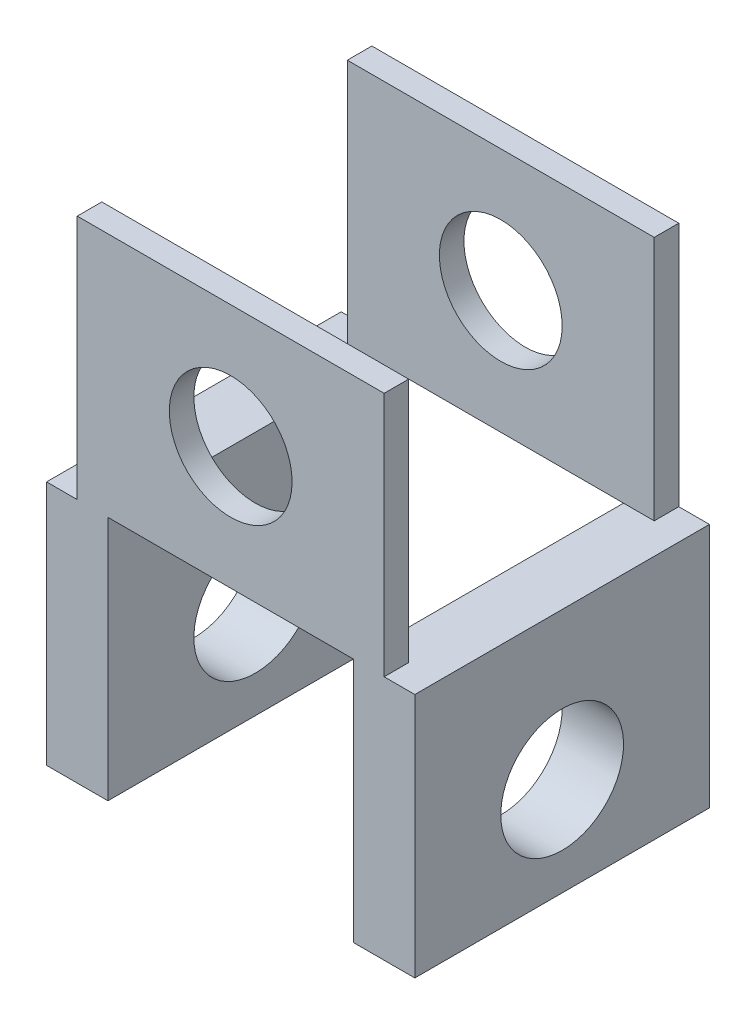
ISO-10303-21;
HEADER;
FILE_DESCRIPTION(('STEP AP214'),'2;1');
FILE_NAME('part.step','',(''),(''),'','','');
FILE_SCHEMA(('AUTOMOTIVE_DESIGN { 1 0 10303 214 1 1 1 1 }'));
ENDSEC;
DATA;
#1=APPLICATION_CONTEXT('core data for automotive mechanical design processes');
#2=APPLICATION_PROTOCOL_DEFINITION('international standard','automotive_design',2000,#1);
#3=PRODUCT_CONTEXT('',#1,'mechanical');
#4=PRODUCT('Part','Part','',(#3));
#5=PRODUCT_RELATED_PRODUCT_CATEGORY('part','',(#4));
#6=PRODUCT_DEFINITION_FORMATION('','',#4);
#7=PRODUCT_DEFINITION_CONTEXT('part definition',#1,'design');
#8=PRODUCT_DEFINITION('design','',#6,#7);
#9=PRODUCT_DEFINITION_SHAPE('','',#8);
#10=(LENGTH_UNIT() NAMED_UNIT(*) SI_UNIT(.MILLI.,.METRE.));
#11=(NAMED_UNIT(*) PLANE_ANGLE_UNIT() SI_UNIT($,.RADIAN.));
#12=(NAMED_UNIT(*) SI_UNIT($,.STERADIAN.) SOLID_ANGLE_UNIT());
#13=UNCERTAINTY_MEASURE_WITH_UNIT(LENGTH_MEASURE(1.E-05),#10,'distance_accuracy_value','');
#14=(GEOMETRIC_REPRESENTATION_CONTEXT(3) GLOBAL_UNCERTAINTY_ASSIGNED_CONTEXT((#13)) GLOBAL_UNIT_ASSIGNED_CONTEXT((#10,
#11,#12)) REPRESENTATION_CONTEXT('',''));
#15=CARTESIAN_POINT('',(0.,0.,0.));
#16=DIRECTION('',(0.,0.,1.));
#17=DIRECTION('',(1.,0.,0.));
#18=AXIS2_PLACEMENT_3D('',#15,#16,#17);
#19=CARTESIAN_POINT('',(0.,-10.,12.));
#20=DIRECTION('',(0.,1.,0.));
#21=DIRECTION('',(0.,0.,1.));
#22=AXIS2_PLACEMENT_3D('',#19,#20,#21);
#23=PLANE('',#22);
#24=DIRECTION('',(1.,0.,0.));
#25=VECTOR('',#24,1.);
#26=CARTESIAN_POINT('',(0.,-10.,24.));
#27=LINE('',#26,#25);
#28=CARTESIAN_POINT('',(-15.,-10.,24.));
#29=VERTEX_POINT('',#28);
#30=CARTESIAN_POINT('',(-12.5,-10.,24.));
#31=VERTEX_POINT('',#30);
#32=EDGE_CURVE('E218',#29,#31,#27,.T.);
#33=ORIENTED_EDGE('',*,*,#32,.T.);
#34=DIRECTION('',(0.,0.,1.));
#35=VECTOR('',#34,1.);
#36=CARTESIAN_POINT('',(-12.5,-10.,22.));
#37=LINE('',#36,#35);
#38=CARTESIAN_POINT('',(-12.5,-10.,22.));
#39=VERTEX_POINT('',#38);
#40=EDGE_CURVE('E197',#39,#31,#37,.T.);
#41=ORIENTED_EDGE('',*,*,#40,.F.);
#42=DIRECTION('',(1.,0.,0.));
#43=VECTOR('',#42,1.);
#44=CARTESIAN_POINT('',(0.,-10.,22.));
#45=LINE('',#44,#43);
#46=CARTESIAN_POINT('',(-10.,-10.,22.));
#47=VERTEX_POINT('',#46);
#48=EDGE_CURVE('E188',#39,#47,#45,.T.);
#49=ORIENTED_EDGE('',*,*,#48,.T.);
#50=DIRECTION('',(0.,0.,-1.));
#51=VECTOR('',#50,1.);
#52=CARTESIAN_POINT('',(-10.,-10.,12.));
#53=LINE('',#52,#51);
#54=CARTESIAN_POINT('',(-10.,-10.,2.));
#55=VERTEX_POINT('',#54);
#56=EDGE_CURVE('E267',#47,#55,#53,.T.);
#57=ORIENTED_EDGE('',*,*,#56,.T.);
#58=DIRECTION('',(1.,0.,0.));
#59=VECTOR('',#58,1.);
#60=CARTESIAN_POINT('',(0.,-10.,2.));
#61=LINE('',#60,#59);
#62=CARTESIAN_POINT('',(-12.5,-10.,2.));
#63=VERTEX_POINT('',#62);
#64=EDGE_CURVE('E300',#63,#55,#61,.T.);
#65=ORIENTED_EDGE('',*,*,#64,.F.);
#66=DIRECTION('',(0.,0.,-1.));
#67=VECTOR('',#66,1.);
#68=CARTESIAN_POINT('',(-12.5,-10.,2.));
#69=LINE('',#68,#67);
#70=CARTESIAN_POINT('',(-12.5,-10.,0.));
#71=VERTEX_POINT('',#70);
#72=EDGE_CURVE('E316',#63,#71,#69,.T.);
#73=ORIENTED_EDGE('',*,*,#72,.T.);
#74=DIRECTION('',(1.,0.,0.));
#75=VECTOR('',#74,1.);
#76=CARTESIAN_POINT('',(0.,-10.,0.));
#77=LINE('',#76,#75);
#78=CARTESIAN_POINT('',(-15.,-10.,0.));
#79=VERTEX_POINT('',#78);
#80=EDGE_CURVE('E240',#79,#71,#77,.T.);
#81=ORIENTED_EDGE('',*,*,#80,.F.);
#82=DIRECTION('',(0.,0.,-1.));
#83=VECTOR('',#82,1.);
#84=CARTESIAN_POINT('',(-15.,-10.,12.));
#85=LINE('',#84,#83);
#86=EDGE_CURVE('E258',#29,#79,#85,.T.);
#87=ORIENTED_EDGE('',*,*,#86,.F.);
#88=EDGE_LOOP('',(#33,#41,#49,#57,#65,#73,#81,#87));
#89=FACE_BOUND('',#88,.T.);
#90=ADVANCED_FACE('F41',(#89),#23,.T.);
#91=CARTESIAN_POINT('',(0.,-10.,2.));
#92=DIRECTION('',(0.,1.,0.));
#93=DIRECTION('',(0.,0.,1.));
#94=AXIS2_PLACEMENT_3D('',#91,#92,#93);
#95=PLANE('',#94);
#96=CARTESIAN_POINT('',(10.,-10.,2.));
#97=VERTEX_POINT('',#96);
#98=EDGE_CURVE('E305',#55,#97,#61,.T.);
#99=ORIENTED_EDGE('',*,*,#98,.F.);
#100=CARTESIAN_POINT('',(-10.,-10.,0.));
#101=VERTEX_POINT('',#100);
#102=EDGE_CURVE('E261',#55,#101,#53,.T.);
#103=ORIENTED_EDGE('',*,*,#102,.T.);
#104=DIRECTION('',(1.,0.,0.));
#105=VECTOR('',#104,1.);
#106=CARTESIAN_POINT('',(0.,-10.,0.));
#107=LINE('',#106,#105);
#108=CARTESIAN_POINT('',(10.,-10.,0.));
#109=VERTEX_POINT('',#108);
#110=EDGE_CURVE('E320',#101,#109,#107,.T.);
#111=ORIENTED_EDGE('',*,*,#110,.T.);
#112=DIRECTION('',(0.,0.,-1.));
#113=VECTOR('',#112,1.);
#114=CARTESIAN_POINT('',(10.,-10.,12.));
#115=LINE('',#114,#113);
#116=EDGE_CURVE('E11',#97,#109,#115,.T.);
#117=ORIENTED_EDGE('',*,*,#116,.F.);
#118=EDGE_LOOP('',(#99,#103,#111,#117));
#119=FACE_BOUND('',#118,.T.);
#120=ADVANCED_FACE('F437',(#119),#95,.F.);
#121=CARTESIAN_POINT('',(12.5,0.,2.));
#122=DIRECTION('',(-1.,0.,0.));
#123=DIRECTION('',(0.,0.,1.));
#124=AXIS2_PLACEMENT_3D('',#121,#122,#123);
#125=PLANE('',#124);
#126=DIRECTION('',(0.,1.,0.));
#127=VECTOR('',#126,1.);
#128=CARTESIAN_POINT('',(12.5,0.,0.));
#129=LINE('',#128,#127);
#130=CARTESIAN_POINT('',(12.5,-10.,0.));
#131=VERTEX_POINT('',#130);
#132=CARTESIAN_POINT('',(12.5,10.,0.));
#133=VERTEX_POINT('',#132);
#134=EDGE_CURVE('E323',#131,#133,#129,.T.);
#135=ORIENTED_EDGE('',*,*,#134,.T.);
#136=DIRECTION('',(0.,0.,-1.));
#137=VECTOR('',#136,1.);
#138=CARTESIAN_POINT('',(12.5,10.,2.));
#139=LINE('',#138,#137);
#140=CARTESIAN_POINT('',(12.5,10.,2.));
#141=VERTEX_POINT('',#140);
#142=EDGE_CURVE('E339',#141,#133,#139,.T.);
#143=ORIENTED_EDGE('',*,*,#142,.F.);
#144=DIRECTION('',(0.,1.,0.));
#145=VECTOR('',#144,1.);
#146=CARTESIAN_POINT('',(12.5,0.,2.));
#147=LINE('',#146,#145);
#148=CARTESIAN_POINT('',(12.5,-10.,2.));
#149=VERTEX_POINT('',#148);
#150=EDGE_CURVE('E304',#149,#141,#147,.T.);
#151=ORIENTED_EDGE('',*,*,#150,.F.);
#152=DIRECTION('',(0.,0.,-1.));
#153=VECTOR('',#152,1.);
#154=CARTESIAN_POINT('',(12.5,-10.,2.));
#155=LINE('',#154,#153);
#156=EDGE_CURVE('E45',#149,#131,#155,.T.);
#157=ORIENTED_EDGE('',*,*,#156,.T.);
#158=EDGE_LOOP('',(#135,#143,#151,#157));
#159=FACE_BOUND('',#158,.T.);
#160=ADVANCED_FACE('F350',(#159),#125,.F.);
#161=CARTESIAN_POINT('',(0.,10.,2.));
#162=DIRECTION('',(0.,1.,0.));
#163=DIRECTION('',(0.,0.,1.));
#164=AXIS2_PLACEMENT_3D('',#161,#162,#163);
#165=PLANE('',#164);
#166=DIRECTION('',(1.,0.,0.));
#167=VECTOR('',#166,1.);
#168=CARTESIAN_POINT('',(0.,10.,0.));
#169=LINE('',#168,#167);
#170=CARTESIAN_POINT('',(-12.5,10.,0.));
#171=VERTEX_POINT('',#170);
#172=EDGE_CURVE('E327',#171,#133,#169,.T.);
#173=ORIENTED_EDGE('',*,*,#172,.F.);
#174=DIRECTION('',(0.,0.,-1.));
#175=VECTOR('',#174,1.);
#176=CARTESIAN_POINT('',(-12.5,10.,2.));
#177=LINE('',#176,#175);
#178=CARTESIAN_POINT('',(-12.5,10.,2.));
#179=VERTEX_POINT('',#178);
#180=EDGE_CURVE('E337',#179,#171,#177,.T.);
#181=ORIENTED_EDGE('',*,*,#180,.F.);
#182=DIRECTION('',(1.,0.,0.));
#183=VECTOR('',#182,1.);
#184=CARTESIAN_POINT('',(0.,10.,2.));
#185=LINE('',#184,#183);
#186=EDGE_CURVE('E308',#179,#141,#185,.T.);
#187=ORIENTED_EDGE('',*,*,#186,.T.);
#188=ORIENTED_EDGE('',*,*,#142,.T.);
#189=EDGE_LOOP('',(#173,#181,#187,#188));
#190=FACE_BOUND('',#189,.T.);
#191=ADVANCED_FACE('F357',(#190),#165,.T.);
#192=CARTESIAN_POINT('',(0.,0.,2.));
#193=DIRECTION('',(0.,0.,-1.));
#194=DIRECTION('',(-1.,0.,0.));
#195=AXIS2_PLACEMENT_3D('',#192,#193,#194);
#196=CYLINDRICAL_SURFACE('',#195,5.);
#197=CARTESIAN_POINT('',(0.,0.,2.));
#198=DIRECTION('',(0.,0.,1.));
#199=DIRECTION('',(1.,0.,0.));
#200=AXIS2_PLACEMENT_3D('',#197,#198,#199);
#201=CIRCLE('',#200,5.);
#202=CARTESIAN_POINT('',(5.,0.,2.));
#203=VERTEX_POINT('',#202);
#204=EDGE_CURVE('E294',#203,#203,#201,.T.);
#205=ORIENTED_EDGE('',*,*,#204,.T.);
#206=EDGE_LOOP('',(#205));
#207=FACE_BOUND('',#206,.T.);
#208=CARTESIAN_POINT('',(0.,0.,0.));
#209=DIRECTION('',(0.,0.,1.));
#210=DIRECTION('',(1.,0.,0.));
#211=AXIS2_PLACEMENT_3D('',#208,#209,#210);
#212=CIRCLE('',#211,5.);
#213=CARTESIAN_POINT('',(5.,0.,0.));
#214=VERTEX_POINT('',#213);
#215=EDGE_CURVE('E293',#214,#214,#212,.T.);
#216=ORIENTED_EDGE('',*,*,#215,.F.);
#217=EDGE_LOOP('',(#216));
#218=FACE_BOUND('',#217,.T.);
#219=ADVANCED_FACE('F43',(#207,#218),#196,.F.);
#220=CARTESIAN_POINT('',(-12.5,0.,2.));
#221=DIRECTION('',(-1.,0.,0.));
#222=DIRECTION('',(0.,0.,1.));
#223=AXIS2_PLACEMENT_3D('',#220,#221,#222);
#224=PLANE('',#223);
#225=DIRECTION('',(0.,1.,0.));
#226=VECTOR('',#225,1.);
#227=CARTESIAN_POINT('',(-12.5,0.,0.));
#228=LINE('',#227,#226);
#229=EDGE_CURVE('E299',#71,#171,#228,.T.);
#230=ORIENTED_EDGE('',*,*,#229,.F.);
#231=ORIENTED_EDGE('',*,*,#72,.F.);
#232=DIRECTION('',(0.,1.,0.));
#233=VECTOR('',#232,1.);
#234=CARTESIAN_POINT('',(-12.5,0.,2.));
#235=LINE('',#234,#233);
#236=EDGE_CURVE('E312',#63,#179,#235,.T.);
#237=ORIENTED_EDGE('',*,*,#236,.T.);
#238=ORIENTED_EDGE('',*,*,#180,.T.);
#239=EDGE_LOOP('',(#230,#231,#237,#238));
#240=FACE_BOUND('',#239,.T.);
#241=ADVANCED_FACE('F364',(#240),#224,.T.);
#242=CARTESIAN_POINT('',(0.,0.,2.));
#243=DIRECTION('',(0.,0.,1.));
#244=DIRECTION('',(1.,0.,0.));
#245=AXIS2_PLACEMENT_3D('',#242,#243,#244);
#246=PLANE('',#245);
#247=ORIENTED_EDGE('',*,*,#204,.F.);
#248=EDGE_LOOP('',(#247));
#249=FACE_BOUND('',#248,.T.);
#250=ORIENTED_EDGE('',*,*,#64,.T.);
#251=ORIENTED_EDGE('',*,*,#98,.T.);
#252=EDGE_CURVE('E298',#97,#149,#61,.T.);
#253=ORIENTED_EDGE('',*,*,#252,.T.);
#254=ORIENTED_EDGE('',*,*,#150,.T.);
#255=ORIENTED_EDGE('',*,*,#186,.F.);
#256=ORIENTED_EDGE('',*,*,#236,.F.);
#257=EDGE_LOOP('',(#250,#251,#253,#254,#255,#256));
#258=FACE_BOUND('',#257,.T.);
#259=ADVANCED_FACE('F362',(#249,#258),#246,.T.);
#260=CARTESIAN_POINT('',(0.,0.,0.));
#261=DIRECTION('',(0.,0.,1.));
#262=DIRECTION('',(1.,0.,0.));
#263=AXIS2_PLACEMENT_3D('',#260,#261,#262);
#264=PLANE('',#263);
#265=ORIENTED_EDGE('',*,*,#215,.T.);
#266=EDGE_LOOP('',(#265));
#267=FACE_BOUND('',#266,.T.);
#268=ORIENTED_EDGE('',*,*,#110,.F.);
#269=DIRECTION('',(0.,-1.,0.));
#270=VECTOR('',#269,1.);
#271=CARTESIAN_POINT('',(-10.,0.,0.));
#272=LINE('',#271,#270);
#273=CARTESIAN_POINT('',(-10.,-30.,0.));
#274=VERTEX_POINT('',#273);
#275=EDGE_CURVE('E236',#101,#274,#272,.T.);
#276=ORIENTED_EDGE('',*,*,#275,.T.);
#277=DIRECTION('',(1.,0.,0.));
#278=VECTOR('',#277,1.);
#279=CARTESIAN_POINT('',(0.,-30.,0.));
#280=LINE('',#279,#278);
#281=CARTESIAN_POINT('',(-15.,-30.,0.));
#282=VERTEX_POINT('',#281);
#283=EDGE_CURVE('E247',#282,#274,#280,.T.);
#284=ORIENTED_EDGE('',*,*,#283,.F.);
#285=DIRECTION('',(0.,-1.,0.));
#286=VECTOR('',#285,1.);
#287=CARTESIAN_POINT('',(-15.,0.,0.));
#288=LINE('',#287,#286);
#289=EDGE_CURVE('E244',#79,#282,#288,.T.);
#290=ORIENTED_EDGE('',*,*,#289,.F.);
#291=ORIENTED_EDGE('',*,*,#80,.T.);
#292=ORIENTED_EDGE('',*,*,#229,.T.);
#293=ORIENTED_EDGE('',*,*,#172,.T.);
#294=ORIENTED_EDGE('',*,*,#134,.F.);
#295=DIRECTION('',(1.,0.,0.));
#296=VECTOR('',#295,1.);
#297=CARTESIAN_POINT('',(0.,-10.,0.));
#298=LINE('',#297,#296);
#299=CARTESIAN_POINT('',(15.,-10.,0.));
#300=VERTEX_POINT('',#299);
#301=EDGE_CURVE('E266',#131,#300,#298,.T.);
#302=ORIENTED_EDGE('',*,*,#301,.T.);
#303=DIRECTION('',(0.,-1.,0.));
#304=VECTOR('',#303,1.);
#305=CARTESIAN_POINT('',(15.,0.,0.));
#306=LINE('',#305,#304);
#307=CARTESIAN_POINT('',(15.,-30.,0.));
#308=VERTEX_POINT('',#307);
#309=EDGE_CURVE('E277',#300,#308,#306,.T.);
#310=ORIENTED_EDGE('',*,*,#309,.T.);
#311=DIRECTION('',(1.,0.,0.));
#312=VECTOR('',#311,1.);
#313=CARTESIAN_POINT('',(0.,-30.,0.));
#314=LINE('',#313,#312);
#315=CARTESIAN_POINT('',(10.,-30.,0.));
#316=VERTEX_POINT('',#315);
#317=EDGE_CURVE('E273',#316,#308,#314,.T.);
#318=ORIENTED_EDGE('',*,*,#317,.F.);
#319=DIRECTION('',(0.,-1.,0.));
#320=VECTOR('',#319,1.);
#321=CARTESIAN_POINT('',(10.,0.,0.));
#322=LINE('',#321,#320);
#323=EDGE_CURVE('E270',#109,#316,#322,.T.);
#324=ORIENTED_EDGE('',*,*,#323,.F.);
#325=EDGE_LOOP('',(#268,#276,#284,#290,#291,#292,#293,#294,#302,#310,#318,#324));
#326=FACE_BOUND('',#325,.T.);
#327=ADVANCED_FACE('F355',(#267,#326),#264,.F.);
#328=CARTESIAN_POINT('',(0.,-10.,12.));
#329=DIRECTION('',(0.,1.,0.));
#330=DIRECTION('',(0.,0.,1.));
#331=AXIS2_PLACEMENT_3D('',#328,#329,#330);
#332=PLANE('',#331);
#333=DIRECTION('',(0.,0.,1.));
#334=VECTOR('',#333,1.);
#335=CARTESIAN_POINT('',(12.5,-10.,22.));
#336=LINE('',#335,#334);
#337=CARTESIAN_POINT('',(12.5,-10.,22.));
#338=VERTEX_POINT('',#337);
#339=CARTESIAN_POINT('',(12.5,-10.,24.));
#340=VERTEX_POINT('',#339);
#341=EDGE_CURVE('E203',#338,#340,#336,.T.);
#342=ORIENTED_EDGE('',*,*,#341,.T.);
#343=DIRECTION('',(1.,0.,0.));
#344=VECTOR('',#343,1.);
#345=CARTESIAN_POINT('',(0.,-10.,24.));
#346=LINE('',#345,#344);
#347=CARTESIAN_POINT('',(15.,-10.,24.));
#348=VERTEX_POINT('',#347);
#349=EDGE_CURVE('E221',#340,#348,#346,.T.);
#350=ORIENTED_EDGE('',*,*,#349,.T.);
#351=DIRECTION('',(0.,0.,-1.));
#352=VECTOR('',#351,1.);
#353=CARTESIAN_POINT('',(15.,-10.,12.));
#354=LINE('',#353,#352);
#355=EDGE_CURVE('E281',#348,#300,#354,.T.);
#356=ORIENTED_EDGE('',*,*,#355,.T.);
#357=ORIENTED_EDGE('',*,*,#301,.F.);
#358=ORIENTED_EDGE('',*,*,#156,.F.);
#359=ORIENTED_EDGE('',*,*,#252,.F.);
#360=CARTESIAN_POINT('',(10.,-10.,22.));
#361=VERTEX_POINT('',#360);
#362=EDGE_CURVE('E53',#361,#97,#115,.T.);
#363=ORIENTED_EDGE('',*,*,#362,.F.);
#364=EDGE_CURVE('E60',#361,#338,#45,.T.);
#365=ORIENTED_EDGE('',*,*,#364,.T.);
#366=EDGE_LOOP('',(#342,#350,#356,#357,#358,#359,#363,#365));
#367=FACE_BOUND('',#366,.T.);
#368=ADVANCED_FACE('F351',(#367),#332,.T.);
#369=CARTESIAN_POINT('',(10.,0.,12.));
#370=DIRECTION('',(1.,0.,0.));
#371=DIRECTION('',(0.,1.,0.));
#372=AXIS2_PLACEMENT_3D('',#369,#370,#371);
#373=PLANE('',#372);
#374=CARTESIAN_POINT('',(10.,-22.,12.));
#375=DIRECTION('',(1.,0.,0.));
#376=DIRECTION('',(0.,1.,0.));
#377=AXIS2_PLACEMENT_3D('',#374,#375,#376);
#378=CIRCLE('',#377,5.);
#379=CARTESIAN_POINT('',(10.,-27.,12.));
#380=VERTEX_POINT('',#379);
#381=EDGE_CURVE('E410',#380,#380,#378,.T.);
#382=ORIENTED_EDGE('',*,*,#381,.T.);
#383=EDGE_LOOP('',(#382));
#384=FACE_BOUND('',#383,.T.);
#385=ORIENTED_EDGE('',*,*,#323,.T.);
#386=DIRECTION('',(0.,0.,-1.));
#387=VECTOR('',#386,1.);
#388=CARTESIAN_POINT('',(10.,-30.,12.));
#389=LINE('',#388,#387);
#390=CARTESIAN_POINT('',(10.,-30.,24.));
#391=VERTEX_POINT('',#390);
#392=EDGE_CURVE('E288',#391,#316,#389,.T.);
#393=ORIENTED_EDGE('',*,*,#392,.F.);
#394=DIRECTION('',(0.,-1.,0.));
#395=VECTOR('',#394,1.);
#396=CARTESIAN_POINT('',(10.,0.,24.));
#397=LINE('',#396,#395);
#398=CARTESIAN_POINT('',(10.,-10.,24.));
#399=VERTEX_POINT('',#398);
#400=EDGE_CURVE('E232',#399,#391,#397,.T.);
#401=ORIENTED_EDGE('',*,*,#400,.F.);
#402=EDGE_CURVE('E52',#399,#361,#115,.T.);
#403=ORIENTED_EDGE('',*,*,#402,.T.);
#404=ORIENTED_EDGE('',*,*,#362,.T.);
#405=ORIENTED_EDGE('',*,*,#116,.T.);
#406=EDGE_LOOP('',(#385,#393,#401,#403,#404,#405));
#407=FACE_BOUND('',#406,.T.);
#408=ADVANCED_FACE('F433',(#384,#407),#373,.F.);
#409=CARTESIAN_POINT('',(0.,-30.,12.));
#410=DIRECTION('',(0.,1.,0.));
#411=DIRECTION('',(0.,0.,1.));
#412=AXIS2_PLACEMENT_3D('',#409,#410,#411);
#413=PLANE('',#412);
#414=ORIENTED_EDGE('',*,*,#317,.T.);
#415=DIRECTION('',(0.,0.,-1.));
#416=VECTOR('',#415,1.);
#417=CARTESIAN_POINT('',(15.,-30.,12.));
#418=LINE('',#417,#416);
#419=CARTESIAN_POINT('',(15.,-30.,24.));
#420=VERTEX_POINT('',#419);
#421=EDGE_CURVE('E285',#420,#308,#418,.T.);
#422=ORIENTED_EDGE('',*,*,#421,.F.);
#423=DIRECTION('',(1.,0.,0.));
#424=VECTOR('',#423,1.);
#425=CARTESIAN_POINT('',(0.,-30.,24.));
#426=LINE('',#425,#424);
#427=EDGE_CURVE('E228',#391,#420,#426,.T.);
#428=ORIENTED_EDGE('',*,*,#427,.F.);
#429=ORIENTED_EDGE('',*,*,#392,.T.);
#430=EDGE_LOOP('',(#414,#422,#428,#429));
#431=FACE_BOUND('',#430,.T.);
#432=ADVANCED_FACE('F430',(#431),#413,.F.);
#433=CARTESIAN_POINT('',(15.,0.,12.));
#434=DIRECTION('',(1.,0.,0.));
#435=DIRECTION('',(0.,1.,0.));
#436=AXIS2_PLACEMENT_3D('',#433,#434,#435);
#437=PLANE('',#436);
#438=CARTESIAN_POINT('',(15.,-22.,12.));
#439=DIRECTION('',(1.,0.,0.));
#440=DIRECTION('',(0.,1.,0.));
#441=AXIS2_PLACEMENT_3D('',#438,#439,#440);
#442=CIRCLE('',#441,5.);
#443=CARTESIAN_POINT('',(15.,-27.,12.));
#444=VERTEX_POINT('',#443);
#445=EDGE_CURVE('E513',#444,#444,#442,.T.);
#446=ORIENTED_EDGE('',*,*,#445,.F.);
#447=EDGE_LOOP('',(#446));
#448=FACE_BOUND('',#447,.T.);
#449=ORIENTED_EDGE('',*,*,#309,.F.);
#450=ORIENTED_EDGE('',*,*,#355,.F.);
#451=DIRECTION('',(0.,-1.,0.));
#452=VECTOR('',#451,1.);
#453=CARTESIAN_POINT('',(15.,0.,24.));
#454=LINE('',#453,#452);
#455=EDGE_CURVE('E224',#348,#420,#454,.T.);
#456=ORIENTED_EDGE('',*,*,#455,.T.);
#457=ORIENTED_EDGE('',*,*,#421,.T.);
#458=EDGE_LOOP('',(#449,#450,#456,#457));
#459=FACE_BOUND('',#458,.T.);
#460=ADVANCED_FACE('F428',(#448,#459),#437,.T.);
#461=CARTESIAN_POINT('',(-10.,0.,12.));
#462=DIRECTION('',(1.,0.,0.));
#463=DIRECTION('',(0.,1.,0.));
#464=AXIS2_PLACEMENT_3D('',#461,#462,#463);
#465=PLANE('',#464);
#466=CARTESIAN_POINT('',(-10.,-22.,12.));
#467=DIRECTION('',(1.,0.,0.));
#468=DIRECTION('',(0.,1.,0.));
#469=AXIS2_PLACEMENT_3D('',#466,#467,#468);
#470=CIRCLE('',#469,5.);
#471=CARTESIAN_POINT('',(-10.,-27.,12.));
#472=VERTEX_POINT('',#471);
#473=EDGE_CURVE('E506',#472,#472,#470,.T.);
#474=ORIENTED_EDGE('',*,*,#473,.F.);
#475=EDGE_LOOP('',(#474));
#476=FACE_BOUND('',#475,.T.);
#477=ORIENTED_EDGE('',*,*,#275,.F.);
#478=ORIENTED_EDGE('',*,*,#102,.F.);
#479=ORIENTED_EDGE('',*,*,#56,.F.);
#480=CARTESIAN_POINT('',(-10.,-10.,24.));
#481=VERTEX_POINT('',#480);
#482=EDGE_CURVE('E262',#481,#47,#53,.T.);
#483=ORIENTED_EDGE('',*,*,#482,.F.);
#484=DIRECTION('',(0.,-1.,0.));
#485=VECTOR('',#484,1.);
#486=CARTESIAN_POINT('',(-10.,0.,24.));
#487=LINE('',#486,#485);
#488=CARTESIAN_POINT('',(-10.,-30.,24.));
#489=VERTEX_POINT('',#488);
#490=EDGE_CURVE('E201',#481,#489,#487,.T.);
#491=ORIENTED_EDGE('',*,*,#490,.T.);
#492=DIRECTION('',(0.,0.,-1.));
#493=VECTOR('',#492,1.);
#494=CARTESIAN_POINT('',(-10.,-30.,12.));
#495=LINE('',#494,#493);
#496=EDGE_CURVE('E251',#489,#274,#495,.T.);
#497=ORIENTED_EDGE('',*,*,#496,.T.);
#498=EDGE_LOOP('',(#477,#478,#479,#483,#491,#497));
#499=FACE_BOUND('',#498,.T.);
#500=ADVANCED_FACE('F388',(#476,#499),#465,.T.);
#501=CARTESIAN_POINT('',(-15.,0.,12.));
#502=DIRECTION('',(1.,0.,0.));
#503=DIRECTION('',(0.,1.,0.));
#504=AXIS2_PLACEMENT_3D('',#501,#502,#503);
#505=PLANE('',#504);
#506=CARTESIAN_POINT('',(-15.,-22.,12.));
#507=DIRECTION('',(-1.,0.,0.));
#508=DIRECTION('',(0.,-1.,0.));
#509=AXIS2_PLACEMENT_3D('',#506,#507,#508);
#510=CIRCLE('',#509,5.);
#511=CARTESIAN_POINT('',(-15.,-27.,12.));
#512=VERTEX_POINT('',#511);
#513=EDGE_CURVE('E509',#512,#512,#510,.T.);
#514=ORIENTED_EDGE('',*,*,#513,.F.);
#515=EDGE_LOOP('',(#514));
#516=FACE_BOUND('',#515,.T.);
#517=ORIENTED_EDGE('',*,*,#289,.T.);
#518=DIRECTION('',(0.,0.,-1.));
#519=VECTOR('',#518,1.);
#520=CARTESIAN_POINT('',(-15.,-30.,12.));
#521=LINE('',#520,#519);
#522=CARTESIAN_POINT('',(-15.,-30.,24.));
#523=VERTEX_POINT('',#522);
#524=EDGE_CURVE('E254',#523,#282,#521,.T.);
#525=ORIENTED_EDGE('',*,*,#524,.F.);
#526=DIRECTION('',(0.,-1.,0.));
#527=VECTOR('',#526,1.);
#528=CARTESIAN_POINT('',(-15.,0.,24.));
#529=LINE('',#528,#527);
#530=EDGE_CURVE('E214',#29,#523,#529,.T.);
#531=ORIENTED_EDGE('',*,*,#530,.F.);
#532=ORIENTED_EDGE('',*,*,#86,.T.);
#533=EDGE_LOOP('',(#517,#525,#531,#532));
#534=FACE_BOUND('',#533,.T.);
#535=ADVANCED_FACE('F370',(#516,#534),#505,.F.);
#536=CARTESIAN_POINT('',(0.,-30.,12.));
#537=DIRECTION('',(0.,1.,0.));
#538=DIRECTION('',(0.,0.,1.));
#539=AXIS2_PLACEMENT_3D('',#536,#537,#538);
#540=PLANE('',#539);
#541=ORIENTED_EDGE('',*,*,#283,.T.);
#542=ORIENTED_EDGE('',*,*,#496,.F.);
#543=DIRECTION('',(1.,0.,0.));
#544=VECTOR('',#543,1.);
#545=CARTESIAN_POINT('',(0.,-30.,24.));
#546=LINE('',#545,#544);
#547=EDGE_CURVE('E210',#523,#489,#546,.T.);
#548=ORIENTED_EDGE('',*,*,#547,.F.);
#549=ORIENTED_EDGE('',*,*,#524,.T.);
#550=EDGE_LOOP('',(#541,#542,#548,#549));
#551=FACE_BOUND('',#550,.T.);
#552=ADVANCED_FACE('F374',(#551),#540,.F.);
#553=CARTESIAN_POINT('',(0.,0.,24.));
#554=DIRECTION('',(0.,0.,-1.));
#555=DIRECTION('',(1.,0.,0.));
#556=AXIS2_PLACEMENT_3D('',#553,#554,#555);
#557=PLANE('',#556);
#558=ORIENTED_EDGE('',*,*,#349,.F.);
#559=DIRECTION('',(0.,1.,0.));
#560=VECTOR('',#559,1.);
#561=CARTESIAN_POINT('',(12.5,0.,24.));
#562=LINE('',#561,#560);
#563=CARTESIAN_POINT('',(12.5,10.,24.));
#564=VERTEX_POINT('',#563);
#565=EDGE_CURVE('E418',#340,#564,#562,.T.);
#566=ORIENTED_EDGE('',*,*,#565,.T.);
#567=DIRECTION('',(1.,0.,0.));
#568=VECTOR('',#567,1.);
#569=CARTESIAN_POINT('',(0.,10.,24.));
#570=LINE('',#569,#568);
#571=CARTESIAN_POINT('',(-12.5,10.,24.));
#572=VERTEX_POINT('',#571);
#573=EDGE_CURVE('E415',#572,#564,#570,.T.);
#574=ORIENTED_EDGE('',*,*,#573,.F.);
#575=DIRECTION('',(0.,1.,0.));
#576=VECTOR('',#575,1.);
#577=CARTESIAN_POINT('',(-12.5,0.,24.));
#578=LINE('',#577,#576);
#579=EDGE_CURVE('E195',#31,#572,#578,.T.);
#580=ORIENTED_EDGE('',*,*,#579,.F.);
#581=ORIENTED_EDGE('',*,*,#32,.F.);
#582=ORIENTED_EDGE('',*,*,#530,.T.);
#583=ORIENTED_EDGE('',*,*,#547,.T.);
#584=ORIENTED_EDGE('',*,*,#490,.F.);
#585=DIRECTION('',(1.,0.,0.));
#586=VECTOR('',#585,1.);
#587=CARTESIAN_POINT('',(0.,-10.,24.));
#588=LINE('',#587,#586);
#589=EDGE_CURVE('E397',#481,#399,#588,.T.);
#590=ORIENTED_EDGE('',*,*,#589,.T.);
#591=ORIENTED_EDGE('',*,*,#400,.T.);
#592=ORIENTED_EDGE('',*,*,#427,.T.);
#593=ORIENTED_EDGE('',*,*,#455,.F.);
#594=EDGE_LOOP('',(#558,#566,#574,#580,#581,#582,#583,#584,#590,#591,#592,#593));
#595=FACE_BOUND('',#594,.T.);
#596=CARTESIAN_POINT('',(0.,0.,24.));
#597=DIRECTION('',(0.,0.,1.));
#598=DIRECTION('',(1.,0.,0.));
#599=AXIS2_PLACEMENT_3D('',#596,#597,#598);
#600=CIRCLE('',#599,5.);
#601=CARTESIAN_POINT('',(5.,0.,24.));
#602=VERTEX_POINT('',#601);
#603=EDGE_CURVE('E406',#602,#602,#600,.T.);
#604=ORIENTED_EDGE('',*,*,#603,.F.);
#605=EDGE_LOOP('',(#604));
#606=FACE_BOUND('',#605,.T.);
#607=ADVANCED_FACE('F377',(#595,#606),#557,.F.);
#608=CARTESIAN_POINT('',(0.,-10.,22.));
#609=DIRECTION('',(0.,-1.,0.));
#610=DIRECTION('',(0.,0.,-1.));
#611=AXIS2_PLACEMENT_3D('',#608,#609,#610);
#612=PLANE('',#611);
#613=ORIENTED_EDGE('',*,*,#402,.F.);
#614=ORIENTED_EDGE('',*,*,#589,.F.);
#615=ORIENTED_EDGE('',*,*,#482,.T.);
#616=EDGE_CURVE('E382',#47,#361,#45,.T.);
#617=ORIENTED_EDGE('',*,*,#616,.T.);
#618=EDGE_LOOP('',(#613,#614,#615,#617));
#619=FACE_BOUND('',#618,.T.);
#620=ADVANCED_FACE('F395',(#619),#612,.T.);
#621=CARTESIAN_POINT('',(-12.5,0.,22.));
#622=DIRECTION('',(1.,0.,0.));
#623=DIRECTION('',(0.,0.,-1.));
#624=AXIS2_PLACEMENT_3D('',#621,#622,#623);
#625=PLANE('',#624);
#626=ORIENTED_EDGE('',*,*,#579,.T.);
#627=DIRECTION('',(0.,0.,1.));
#628=VECTOR('',#627,1.);
#629=CARTESIAN_POINT('',(-12.5,10.,22.));
#630=LINE('',#629,#628);
#631=CARTESIAN_POINT('',(-12.5,10.,22.));
#632=VERTEX_POINT('',#631);
#633=EDGE_CURVE('E174',#632,#572,#630,.T.);
#634=ORIENTED_EDGE('',*,*,#633,.F.);
#635=DIRECTION('',(0.,1.,0.));
#636=VECTOR('',#635,1.);
#637=CARTESIAN_POINT('',(-12.5,0.,22.));
#638=LINE('',#637,#636);
#639=EDGE_CURVE('E182',#39,#632,#638,.T.);
#640=ORIENTED_EDGE('',*,*,#639,.F.);
#641=ORIENTED_EDGE('',*,*,#40,.T.);
#642=EDGE_LOOP('',(#626,#634,#640,#641));
#643=FACE_BOUND('',#642,.T.);
#644=ADVANCED_FACE('F193',(#643),#625,.F.);
#645=CARTESIAN_POINT('',(0.,10.,22.));
#646=DIRECTION('',(0.,-1.,0.));
#647=DIRECTION('',(0.,0.,-1.));
#648=AXIS2_PLACEMENT_3D('',#645,#646,#647);
#649=PLANE('',#648);
#650=ORIENTED_EDGE('',*,*,#573,.T.);
#651=DIRECTION('',(0.,0.,1.));
#652=VECTOR('',#651,1.);
#653=CARTESIAN_POINT('',(12.5,10.,22.));
#654=LINE('',#653,#652);
#655=CARTESIAN_POINT('',(12.5,10.,22.));
#656=VERTEX_POINT('',#655);
#657=EDGE_CURVE('E176',#656,#564,#654,.T.);
#658=ORIENTED_EDGE('',*,*,#657,.F.);
#659=DIRECTION('',(1.,0.,0.));
#660=VECTOR('',#659,1.);
#661=CARTESIAN_POINT('',(0.,10.,22.));
#662=LINE('',#661,#660);
#663=EDGE_CURVE('E169',#632,#656,#662,.T.);
#664=ORIENTED_EDGE('',*,*,#663,.F.);
#665=ORIENTED_EDGE('',*,*,#633,.T.);
#666=EDGE_LOOP('',(#650,#658,#664,#665));
#667=FACE_BOUND('',#666,.T.);
#668=ADVANCED_FACE('F172',(#667),#649,.F.);
#669=CARTESIAN_POINT('',(0.,0.,22.));
#670=DIRECTION('',(0.,0.,1.));
#671=DIRECTION('',(1.,0.,0.));
#672=AXIS2_PLACEMENT_3D('',#669,#670,#671);
#673=CYLINDRICAL_SURFACE('',#672,5.);
#674=CARTESIAN_POINT('',(0.,0.,22.));
#675=DIRECTION('',(0.,0.,1.));
#676=DIRECTION('',(1.,0.,0.));
#677=AXIS2_PLACEMENT_3D('',#674,#675,#676);
#678=CIRCLE('',#677,5.);
#679=CARTESIAN_POINT('',(5.,0.,22.));
#680=VERTEX_POINT('',#679);
#681=EDGE_CURVE('E400',#680,#680,#678,.T.);
#682=ORIENTED_EDGE('',*,*,#681,.F.);
#683=EDGE_LOOP('',(#682));
#684=FACE_BOUND('',#683,.T.);
#685=ORIENTED_EDGE('',*,*,#603,.T.);
#686=EDGE_LOOP('',(#685));
#687=FACE_BOUND('',#686,.T.);
#688=ADVANCED_FACE('F480',(#684,#687),#673,.F.);
#689=CARTESIAN_POINT('',(12.5,0.,22.));
#690=DIRECTION('',(1.,0.,0.));
#691=DIRECTION('',(0.,0.,-1.));
#692=AXIS2_PLACEMENT_3D('',#689,#690,#691);
#693=PLANE('',#692);
#694=ORIENTED_EDGE('',*,*,#565,.F.);
#695=ORIENTED_EDGE('',*,*,#341,.F.);
#696=DIRECTION('',(0.,1.,0.));
#697=VECTOR('',#696,1.);
#698=CARTESIAN_POINT('',(12.5,0.,22.));
#699=LINE('',#698,#697);
#700=EDGE_CURVE('E181',#338,#656,#699,.T.);
#701=ORIENTED_EDGE('',*,*,#700,.T.);
#702=ORIENTED_EDGE('',*,*,#657,.T.);
#703=EDGE_LOOP('',(#694,#695,#701,#702));
#704=FACE_BOUND('',#703,.T.);
#705=ADVANCED_FACE('F424',(#704),#693,.T.);
#706=CARTESIAN_POINT('',(0.,0.,22.));
#707=DIRECTION('',(0.,0.,-1.));
#708=DIRECTION('',(1.,0.,0.));
#709=AXIS2_PLACEMENT_3D('',#706,#707,#708);
#710=PLANE('',#709);
#711=ORIENTED_EDGE('',*,*,#681,.T.);
#712=EDGE_LOOP('',(#711));
#713=FACE_BOUND('',#712,.T.);
#714=ORIENTED_EDGE('',*,*,#48,.F.);
#715=ORIENTED_EDGE('',*,*,#639,.T.);
#716=ORIENTED_EDGE('',*,*,#663,.T.);
#717=ORIENTED_EDGE('',*,*,#700,.F.);
#718=ORIENTED_EDGE('',*,*,#364,.F.);
#719=ORIENTED_EDGE('',*,*,#616,.F.);
#720=EDGE_LOOP('',(#714,#715,#716,#717,#718,#719));
#721=FACE_BOUND('',#720,.T.);
#722=ADVANCED_FACE('F186',(#713,#721),#710,.T.);
#723=CARTESIAN_POINT('',(33.,-22.,12.));
#724=DIRECTION('',(-1.,0.,0.));
#725=DIRECTION('',(0.,-1.,0.));
#726=AXIS2_PLACEMENT_3D('',#723,#724,#725);
#727=CYLINDRICAL_SURFACE('',#726,5.);
#728=CARTESIAN_POINT('',(-10.,-27.,12.));
#729=CARTESIAN_POINT('',(-10.0520833333333,-27.,12.));
#730=CARTESIAN_POINT('',(-10.1041666666667,-27.,12.));
#731=CARTESIAN_POINT('',(-10.2083333333333,-27.,12.));
#732=CARTESIAN_POINT('',(-10.2604166666667,-27.,12.));
#733=CARTESIAN_POINT('',(-10.3645833333333,-27.,12.));
#734=CARTESIAN_POINT('',(-10.4166666666667,-27.,12.));
#735=CARTESIAN_POINT('',(-10.5208333333333,-27.,12.));
#736=CARTESIAN_POINT('',(-10.5729166666667,-27.,12.));
#737=CARTESIAN_POINT('',(-10.6770833333333,-27.,12.));
#738=CARTESIAN_POINT('',(-10.7291666666667,-27.,12.));
#739=CARTESIAN_POINT('',(-10.8333333333333,-27.,12.));
#740=CARTESIAN_POINT('',(-10.8854166666667,-27.,12.));
#741=CARTESIAN_POINT('',(-10.9895833333333,-27.,12.));
#742=CARTESIAN_POINT('',(-11.0416666666667,-27.,12.));
#743=CARTESIAN_POINT('',(-11.1458333333333,-27.,12.));
#744=CARTESIAN_POINT('',(-11.1979166666667,-27.,12.));
#745=CARTESIAN_POINT('',(-11.3020833333333,-27.,12.));
#746=CARTESIAN_POINT('',(-11.3541666666667,-27.,12.));
#747=CARTESIAN_POINT('',(-11.4583333333333,-27.,12.));
#748=CARTESIAN_POINT('',(-11.5104166666667,-27.,12.));
#749=CARTESIAN_POINT('',(-11.6145833333333,-27.,12.));
#750=CARTESIAN_POINT('',(-11.6666666666667,-27.,12.));
#751=CARTESIAN_POINT('',(-11.7708333333333,-27.,12.));
#752=CARTESIAN_POINT('',(-11.8229166666667,-27.,12.));
#753=CARTESIAN_POINT('',(-11.9270833333333,-27.,12.));
#754=CARTESIAN_POINT('',(-11.9791666666667,-27.,12.));
#755=CARTESIAN_POINT('',(-12.0833333333333,-27.,12.));
#756=CARTESIAN_POINT('',(-12.1354166666667,-27.,12.));
#757=CARTESIAN_POINT('',(-12.2395833333333,-27.,12.));
#758=CARTESIAN_POINT('',(-12.2916666666667,-27.,12.));
#759=CARTESIAN_POINT('',(-12.3958333333333,-27.,12.));
#760=CARTESIAN_POINT('',(-12.4479166666667,-27.,12.));
#761=CARTESIAN_POINT('',(-12.5520833333333,-27.,12.));
#762=CARTESIAN_POINT('',(-12.6041666666667,-27.,12.));
#763=CARTESIAN_POINT('',(-12.7083333333333,-27.,12.));
#764=CARTESIAN_POINT('',(-12.7604166666667,-27.,12.));
#765=CARTESIAN_POINT('',(-12.8645833333333,-27.,12.));
#766=CARTESIAN_POINT('',(-12.9166666666667,-27.,12.));
#767=CARTESIAN_POINT('',(-13.0208333333333,-27.,12.));
#768=CARTESIAN_POINT('',(-13.0729166666667,-27.,12.));
#769=CARTESIAN_POINT('',(-13.1770833333333,-27.,12.));
#770=CARTESIAN_POINT('',(-13.2291666666667,-27.,12.));
#771=CARTESIAN_POINT('',(-13.3333333333333,-27.,12.));
#772=CARTESIAN_POINT('',(-13.3854166666667,-27.,12.));
#773=CARTESIAN_POINT('',(-13.4895833333333,-27.,12.));
#774=CARTESIAN_POINT('',(-13.5416666666667,-27.,12.));
#775=CARTESIAN_POINT('',(-13.6458333333333,-27.,12.));
#776=CARTESIAN_POINT('',(-13.6979166666667,-27.,12.));
#777=CARTESIAN_POINT('',(-13.8020833333333,-27.,12.));
#778=CARTESIAN_POINT('',(-13.8541666666667,-27.,12.));
#779=CARTESIAN_POINT('',(-13.9583333333333,-27.,12.));
#780=CARTESIAN_POINT('',(-14.0104166666667,-27.,12.));
#781=CARTESIAN_POINT('',(-14.1145833333333,-27.,12.));
#782=CARTESIAN_POINT('',(-14.1666666666667,-27.,12.));
#783=CARTESIAN_POINT('',(-14.2708333333333,-27.,12.));
#784=CARTESIAN_POINT('',(-14.3229166666667,-27.,12.));
#785=CARTESIAN_POINT('',(-14.4270833333333,-27.,12.));
#786=CARTESIAN_POINT('',(-14.4791666666667,-27.,12.));
#787=CARTESIAN_POINT('',(-14.5833333333333,-27.,12.));
#788=CARTESIAN_POINT('',(-14.6354166666667,-27.,12.));
#789=CARTESIAN_POINT('',(-14.7395833333333,-27.,12.));
#790=CARTESIAN_POINT('',(-14.7916666666667,-27.,12.));
#791=CARTESIAN_POINT('',(-14.8958333333333,-27.,12.));
#792=CARTESIAN_POINT('',(-14.9479166666667,-27.,12.));
#793=CARTESIAN_POINT('',(-15.,-27.,12.));
#794=B_SPLINE_CURVE_WITH_KNOTS('',3,(#728,#729,#730,#731,#732,#733,#734,#735,#736,#737,#738,
#739,#740,#741,#742,#743,#744,#745,#746,#747,#748,#749,#750,#751,#752,#753,#754,#755,#756,#757,
#758,#759,#760,#761,#762,#763,#764,#765,#766,#767,#768,#769,#770,#771,#772,#773,#774,#775,#776,
#777,#778,#779,#780,#781,#782,#783,#784,#785,#786,#787,#788,#789,#790,#791,#792,#793),
.UNSPECIFIED.,.F.,.F.,(4,2,2,2,2,2,2,2,2,2,2,2,2,2,2,2,2,2,2,2,2,2,2,2,2,2,2,2,2,2,2,2,4),(0.,
0.156249999999997,0.3125,0.468750000000004,0.625000000000001,0.781249999999997,
0.937500000000001,1.09375,1.25,1.40625,1.5625,1.71875,1.875,2.03125,2.1875,2.34375000000001,2.5,
2.65625,2.8125,2.96875000000001,3.125,3.28125,3.4375,3.59375000000001,3.75,3.90625,4.0625,
4.21875000000001,4.375,4.53125,4.6875,4.84375000000001,5.),.UNSPECIFIED.);
#795=EDGE_CURVE('BSEAM494',#472,#512,#794,.T.);
#796=ORIENTED_EDGE('',*,*,#473,.T.);
#797=ORIENTED_EDGE('',*,*,#513,.T.);
#798=ORIENTED_EDGE('',*,*,#795,.T.);
#799=ORIENTED_EDGE('',*,*,#795,.F.);
#800=EDGE_LOOP('',(#796,#798,#797,#799));
#801=FACE_BOUND('',#800,.T.);
#802=ADVANCED_FACE('F494',(#801),#727,.F.);
#803=CARTESIAN_POINT('',(15.,-27.,12.));
#804=CARTESIAN_POINT('',(14.9479166666667,-27.,12.));
#805=CARTESIAN_POINT('',(14.8958333333333,-27.,12.));
#806=CARTESIAN_POINT('',(14.7916666666667,-27.,12.));
#807=CARTESIAN_POINT('',(14.7395833333333,-27.,12.));
#808=CARTESIAN_POINT('',(14.6354166666667,-27.,12.));
#809=CARTESIAN_POINT('',(14.5833333333333,-27.,12.));
#810=CARTESIAN_POINT('',(14.4791666666667,-27.,12.));
#811=CARTESIAN_POINT('',(14.4270833333333,-27.,12.));
#812=CARTESIAN_POINT('',(14.3229166666667,-27.,12.));
#813=CARTESIAN_POINT('',(14.2708333333333,-27.,12.));
#814=CARTESIAN_POINT('',(14.1666666666667,-27.,12.));
#815=CARTESIAN_POINT('',(14.1145833333333,-27.,12.));
#816=CARTESIAN_POINT('',(14.0104166666667,-27.,12.));
#817=CARTESIAN_POINT('',(13.9583333333333,-27.,12.));
#818=CARTESIAN_POINT('',(13.8541666666667,-27.,12.));
#819=CARTESIAN_POINT('',(13.8020833333333,-27.,12.));
#820=CARTESIAN_POINT('',(13.6979166666667,-27.,12.));
#821=CARTESIAN_POINT('',(13.6458333333333,-27.,12.));
#822=CARTESIAN_POINT('',(13.5416666666667,-27.,12.));
#823=CARTESIAN_POINT('',(13.4895833333333,-27.,12.));
#824=CARTESIAN_POINT('',(13.3854166666667,-27.,12.));
#825=CARTESIAN_POINT('',(13.3333333333333,-27.,12.));
#826=CARTESIAN_POINT('',(13.2291666666667,-27.,12.));
#827=CARTESIAN_POINT('',(13.1770833333333,-27.,12.));
#828=CARTESIAN_POINT('',(13.0729166666667,-27.,12.));
#829=CARTESIAN_POINT('',(13.0208333333333,-27.,12.));
#830=CARTESIAN_POINT('',(12.9166666666667,-27.,12.));
#831=CARTESIAN_POINT('',(12.8645833333333,-27.,12.));
#832=CARTESIAN_POINT('',(12.7604166666667,-27.,12.));
#833=CARTESIAN_POINT('',(12.7083333333333,-27.,12.));
#834=CARTESIAN_POINT('',(12.6041666666667,-27.,12.));
#835=CARTESIAN_POINT('',(12.5520833333333,-27.,12.));
#836=CARTESIAN_POINT('',(12.4479166666667,-27.,12.));
#837=CARTESIAN_POINT('',(12.3958333333333,-27.,12.));
#838=CARTESIAN_POINT('',(12.2916666666667,-27.,12.));
#839=CARTESIAN_POINT('',(12.2395833333333,-27.,12.));
#840=CARTESIAN_POINT('',(12.1354166666667,-27.,12.));
#841=CARTESIAN_POINT('',(12.0833333333333,-27.,12.));
#842=CARTESIAN_POINT('',(11.9791666666667,-27.,12.));
#843=CARTESIAN_POINT('',(11.9270833333333,-27.,12.));
#844=CARTESIAN_POINT('',(11.8229166666667,-27.,12.));
#845=CARTESIAN_POINT('',(11.7708333333333,-27.,12.));
#846=CARTESIAN_POINT('',(11.6666666666667,-27.,12.));
#847=CARTESIAN_POINT('',(11.6145833333333,-27.,12.));
#848=CARTESIAN_POINT('',(11.5104166666667,-27.,12.));
#849=CARTESIAN_POINT('',(11.4583333333333,-27.,12.));
#850=CARTESIAN_POINT('',(11.3541666666667,-27.,12.));
#851=CARTESIAN_POINT('',(11.3020833333333,-27.,12.));
#852=CARTESIAN_POINT('',(11.1979166666667,-27.,12.));
#853=CARTESIAN_POINT('',(11.1458333333333,-27.,12.));
#854=CARTESIAN_POINT('',(11.0416666666667,-27.,12.));
#855=CARTESIAN_POINT('',(10.9895833333333,-27.,12.));
#856=CARTESIAN_POINT('',(10.8854166666667,-27.,12.));
#857=CARTESIAN_POINT('',(10.8333333333333,-27.,12.));
#858=CARTESIAN_POINT('',(10.7291666666667,-27.,12.));
#859=CARTESIAN_POINT('',(10.6770833333333,-27.,12.));
#860=CARTESIAN_POINT('',(10.5729166666667,-27.,12.));
#861=CARTESIAN_POINT('',(10.5208333333333,-27.,12.));
#862=CARTESIAN_POINT('',(10.4166666666667,-27.,12.));
#863=CARTESIAN_POINT('',(10.3645833333333,-27.,12.));
#864=CARTESIAN_POINT('',(10.2604166666667,-27.,12.));
#865=CARTESIAN_POINT('',(10.2083333333333,-27.,12.));
#866=CARTESIAN_POINT('',(10.1041666666667,-27.,12.));
#867=CARTESIAN_POINT('',(10.0520833333333,-27.,12.));
#868=CARTESIAN_POINT('',(10.,-27.,12.));
#869=B_SPLINE_CURVE_WITH_KNOTS('',3,(#803,#804,#805,#806,#807,#808,#809,#810,#811,#812,#813,
#814,#815,#816,#817,#818,#819,#820,#821,#822,#823,#824,#825,#826,#827,#828,#829,#830,#831,#832,
#833,#834,#835,#836,#837,#838,#839,#840,#841,#842,#843,#844,#845,#846,#847,#848,#849,#850,#851,
#852,#853,#854,#855,#856,#857,#858,#859,#860,#861,#862,#863,#864,#865,#866,#867,#868),
.UNSPECIFIED.,.F.,.F.,(4,2,2,2,2,2,2,2,2,2,2,2,2,2,2,2,2,2,2,2,2,2,2,2,2,2,2,2,2,2,2,2,4),(0.,
0.15625,0.3125,0.46875,0.625000000000001,0.781250000000001,0.937500000000001,1.09375,1.25,
1.40625,1.5625,1.71875,1.875,2.03125,2.1875,2.34375,2.5,2.65625,2.8125,2.96875,3.125,3.28125,
3.4375,3.59375,3.75,3.90625,4.0625,4.21875,4.375,4.53125,4.6875,4.84375,5.),.UNSPECIFIED.);
#870=EDGE_CURVE('BSEAM497',#444,#380,#869,.T.);
#871=ORIENTED_EDGE('',*,*,#445,.T.);
#872=ORIENTED_EDGE('',*,*,#381,.F.);
#873=ORIENTED_EDGE('',*,*,#870,.T.);
#874=ORIENTED_EDGE('',*,*,#870,.F.);
#875=EDGE_LOOP('',(#871,#873,#872,#874));
#876=FACE_BOUND('',#875,.T.);
#877=ADVANCED_FACE('F497',(#876),#727,.F.);
#878=CLOSED_SHELL('',(#90,#120,#160,#191,#219,#241,#259,#327,#368,#408,#432,#460,#500,#535,#552,
#607,#620,#644,#668,#688,#705,#722,#802,#877));
#879=MANIFOLD_SOLID_BREP('B2',#878);
#880=ADVANCED_BREP_SHAPE_REPRESENTATION('',(#18,#879),#14);
#881=SHAPE_DEFINITION_REPRESENTATION(#9,#880);
ENDSEC;
END-ISO-10303-21;
